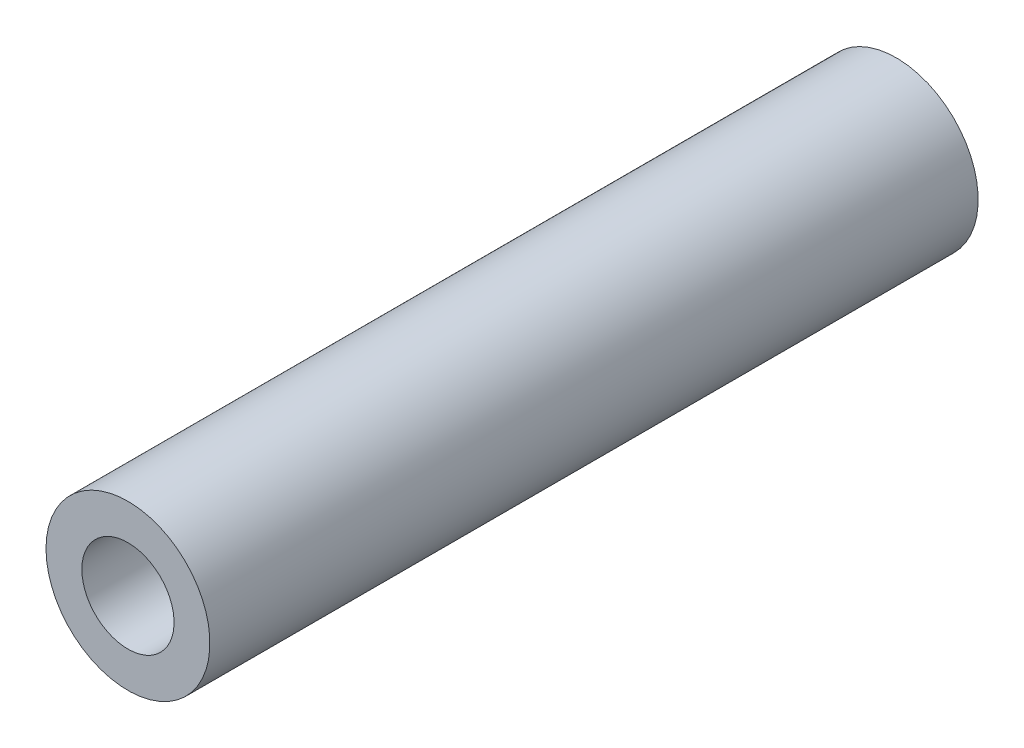
ISO-10303-21;
HEADER;
FILE_DESCRIPTION(('STEP AP214'),'2;1');
FILE_NAME('part.step','',(''),(''),'','','');
FILE_SCHEMA(('AUTOMOTIVE_DESIGN { 1 0 10303 214 1 1 1 1 }'));
ENDSEC;
DATA;
#1=APPLICATION_CONTEXT('core data for automotive mechanical design processes');
#2=APPLICATION_PROTOCOL_DEFINITION('international standard','automotive_design',2000,#1);
#3=PRODUCT_CONTEXT('',#1,'mechanical');
#4=PRODUCT('Part','Part','',(#3));
#5=PRODUCT_RELATED_PRODUCT_CATEGORY('part','',(#4));
#6=PRODUCT_DEFINITION_FORMATION('','',#4);
#7=PRODUCT_DEFINITION_CONTEXT('part definition',#1,'design');
#8=PRODUCT_DEFINITION('design','',#6,#7);
#9=PRODUCT_DEFINITION_SHAPE('','',#8);
#10=(LENGTH_UNIT() NAMED_UNIT(*) SI_UNIT(.MILLI.,.METRE.));
#11=(NAMED_UNIT(*) PLANE_ANGLE_UNIT() SI_UNIT($,.RADIAN.));
#12=(NAMED_UNIT(*) SI_UNIT($,.STERADIAN.) SOLID_ANGLE_UNIT());
#13=UNCERTAINTY_MEASURE_WITH_UNIT(LENGTH_MEASURE(1.E-05),#10,'distance_accuracy_value','');
#14=(GEOMETRIC_REPRESENTATION_CONTEXT(3) GLOBAL_UNCERTAINTY_ASSIGNED_CONTEXT((#13)) GLOBAL_UNIT_ASSIGNED_CONTEXT((#10,
#11,#12)) REPRESENTATION_CONTEXT('',''));
#15=CARTESIAN_POINT('',(0.,0.,0.));
#16=DIRECTION('',(0.,0.,1.));
#17=DIRECTION('',(1.,0.,0.));
#18=AXIS2_PLACEMENT_3D('',#15,#16,#17);
#19=CARTESIAN_POINT('',(0.,0.,45.));
#20=DIRECTION('',(0.,0.,-1.));
#21=DIRECTION('',(-1.,0.,0.));
#22=AXIS2_PLACEMENT_3D('',#19,#20,#21);
#23=CYLINDRICAL_SURFACE('',#22,2.7);
#24=CARTESIAN_POINT('',(0.,0.,45.));
#25=DIRECTION('',(0.,0.,1.));
#26=DIRECTION('',(1.,0.,0.));
#27=AXIS2_PLACEMENT_3D('',#24,#25,#26);
#28=CIRCLE('',#27,2.7);
#29=CARTESIAN_POINT('',(-2.7,0.,45.));
#30=VERTEX_POINT('',#29);
#31=EDGE_CURVE('E45',#30,#30,#28,.T.);
#32=CARTESIAN_POINT('',(0.,0.,0.));
#33=DIRECTION('',(0.,0.,1.));
#34=DIRECTION('',(1.,0.,0.));
#35=AXIS2_PLACEMENT_3D('',#32,#33,#34);
#36=CIRCLE('',#35,2.7);
#37=CARTESIAN_POINT('',(-2.7,0.,0.));
#38=VERTEX_POINT('',#37);
#39=EDGE_CURVE('E51',#38,#38,#36,.T.);
#40=CARTESIAN_POINT('',(-2.7,0.,45.));
#41=CARTESIAN_POINT('',(-2.7,0.,44.53125));
#42=CARTESIAN_POINT('',(-2.7,0.,44.0625));
#43=CARTESIAN_POINT('',(-2.7,0.,43.125));
#44=CARTESIAN_POINT('',(-2.7,0.,42.65625));
#45=CARTESIAN_POINT('',(-2.7,0.,41.71875));
#46=CARTESIAN_POINT('',(-2.7,0.,41.25));
#47=CARTESIAN_POINT('',(-2.7,0.,40.3125));
#48=CARTESIAN_POINT('',(-2.7,0.,39.84375));
#49=CARTESIAN_POINT('',(-2.7,0.,38.90625));
#50=CARTESIAN_POINT('',(-2.7,0.,38.4375));
#51=CARTESIAN_POINT('',(-2.7,0.,37.5));
#52=CARTESIAN_POINT('',(-2.7,0.,37.03125));
#53=CARTESIAN_POINT('',(-2.7,0.,36.09375));
#54=CARTESIAN_POINT('',(-2.7,0.,35.625));
#55=CARTESIAN_POINT('',(-2.7,0.,34.6875));
#56=CARTESIAN_POINT('',(-2.7,0.,34.21875));
#57=CARTESIAN_POINT('',(-2.7,0.,33.28125));
#58=CARTESIAN_POINT('',(-2.7,0.,32.8125));
#59=CARTESIAN_POINT('',(-2.7,0.,31.875));
#60=CARTESIAN_POINT('',(-2.7,0.,31.40625));
#61=CARTESIAN_POINT('',(-2.7,0.,30.46875));
#62=CARTESIAN_POINT('',(-2.7,0.,30.));
#63=CARTESIAN_POINT('',(-2.7,0.,29.0625));
#64=CARTESIAN_POINT('',(-2.7,0.,28.59375));
#65=CARTESIAN_POINT('',(-2.7,0.,27.65625));
#66=CARTESIAN_POINT('',(-2.7,0.,27.1875));
#67=CARTESIAN_POINT('',(-2.7,0.,26.25));
#68=CARTESIAN_POINT('',(-2.7,0.,25.78125));
#69=CARTESIAN_POINT('',(-2.7,0.,24.84375));
#70=CARTESIAN_POINT('',(-2.7,0.,24.375));
#71=CARTESIAN_POINT('',(-2.7,0.,23.4375));
#72=CARTESIAN_POINT('',(-2.7,0.,22.96875));
#73=CARTESIAN_POINT('',(-2.7,0.,22.03125));
#74=CARTESIAN_POINT('',(-2.7,0.,21.5625));
#75=CARTESIAN_POINT('',(-2.7,0.,20.625));
#76=CARTESIAN_POINT('',(-2.7,0.,20.15625));
#77=CARTESIAN_POINT('',(-2.7,0.,19.21875));
#78=CARTESIAN_POINT('',(-2.7,0.,18.75));
#79=CARTESIAN_POINT('',(-2.7,0.,17.8125));
#80=CARTESIAN_POINT('',(-2.7,0.,17.34375));
#81=CARTESIAN_POINT('',(-2.7,0.,16.40625));
#82=CARTESIAN_POINT('',(-2.7,0.,15.9375));
#83=CARTESIAN_POINT('',(-2.7,0.,15.));
#84=CARTESIAN_POINT('',(-2.7,0.,14.53125));
#85=CARTESIAN_POINT('',(-2.7,0.,13.59375));
#86=CARTESIAN_POINT('',(-2.7,0.,13.125));
#87=CARTESIAN_POINT('',(-2.7,0.,12.1875));
#88=CARTESIAN_POINT('',(-2.7,0.,11.71875));
#89=CARTESIAN_POINT('',(-2.7,0.,10.78125));
#90=CARTESIAN_POINT('',(-2.7,0.,10.3125));
#91=CARTESIAN_POINT('',(-2.7,0.,9.375));
#92=CARTESIAN_POINT('',(-2.7,0.,8.90625));
#93=CARTESIAN_POINT('',(-2.7,0.,7.96874999999999));
#94=CARTESIAN_POINT('',(-2.7,0.,7.5));
#95=CARTESIAN_POINT('',(-2.7,0.,6.5625));
#96=CARTESIAN_POINT('',(-2.7,0.,6.09375));
#97=CARTESIAN_POINT('',(-2.7,0.,5.15625));
#98=CARTESIAN_POINT('',(-2.7,0.,4.68749999999999));
#99=CARTESIAN_POINT('',(-2.7,0.,3.74999999999999));
#100=CARTESIAN_POINT('',(-2.7,0.,3.28124999999999));
#101=CARTESIAN_POINT('',(-2.7,0.,2.34374999999999));
#102=CARTESIAN_POINT('',(-2.7,0.,1.87499999999999));
#103=CARTESIAN_POINT('',(-2.7,0.,0.937499999999992));
#104=CARTESIAN_POINT('',(-2.7,0.,0.468749999999993));
#105=CARTESIAN_POINT('',(-2.7,0.,0.));
#106=B_SPLINE_CURVE_WITH_KNOTS('',3,(#40,#41,#42,#43,#44,#45,#46,#47,#48,#49,#50,#51,#52,#53,
#54,#55,#56,#57,#58,#59,#60,#61,#62,#63,#64,#65,#66,#67,#68,#69,#70,#71,#72,#73,#74,#75,#76,#77,
#78,#79,#80,#81,#82,#83,#84,#85,#86,#87,#88,#89,#90,#91,#92,#93,#94,#95,#96,#97,#98,#99,#100,
#101,#102,#103,#104,#105),.UNSPECIFIED.,.F.,.F.,(4,2,2,2,2,2,2,2,2,2,2,2,2,2,2,2,2,2,2,2,2,2,2,
2,2,2,2,2,2,2,2,2,4),(0.,1.40625,2.8125,4.21875000000001,5.62500000000001,7.03125,8.4375,
9.84375000000001,11.25,12.65625,14.0625,15.46875,16.875,18.28125,19.6875,21.09375,22.5,23.90625,
25.3125,26.71875,28.125,29.53125,30.9375,32.34375,33.75,35.15625,36.5625,37.96875,39.375,
40.78125,42.1875,43.59375,45.),.UNSPECIFIED.);
#107=EDGE_CURVE('BSEAM38',#30,#38,#106,.T.);
#108=ORIENTED_EDGE('',*,*,#31,.T.);
#109=ORIENTED_EDGE('',*,*,#39,.F.);
#110=ORIENTED_EDGE('',*,*,#107,.T.);
#111=ORIENTED_EDGE('',*,*,#107,.F.);
#112=EDGE_LOOP('',(#108,#110,#109,#111));
#113=FACE_BOUND('',#112,.T.);
#114=ADVANCED_FACE('F38',(#113),#23,.F.);
#115=CARTESIAN_POINT('',(0.,0.,45.));
#116=DIRECTION('',(0.,0.,-1.));
#117=DIRECTION('',(-1.,0.,0.));
#118=AXIS2_PLACEMENT_3D('',#115,#116,#117);
#119=CYLINDRICAL_SURFACE('',#118,4.8);
#120=CARTESIAN_POINT('',(0.,0.,45.));
#121=DIRECTION('',(0.,0.,1.));
#122=DIRECTION('',(1.,0.,0.));
#123=AXIS2_PLACEMENT_3D('',#120,#121,#122);
#124=CIRCLE('',#123,4.8);
#125=CARTESIAN_POINT('',(-4.8,0.,45.));
#126=VERTEX_POINT('',#125);
#127=EDGE_CURVE('E10',#126,#126,#124,.T.);
#128=CARTESIAN_POINT('',(0.,0.,0.));
#129=DIRECTION('',(0.,0.,1.));
#130=DIRECTION('',(1.,0.,0.));
#131=AXIS2_PLACEMENT_3D('',#128,#129,#130);
#132=CIRCLE('',#131,4.8);
#133=CARTESIAN_POINT('',(-4.8,0.,0.));
#134=VERTEX_POINT('',#133);
#135=EDGE_CURVE('E41',#134,#134,#132,.T.);
#136=CARTESIAN_POINT('',(-4.8,0.,45.));
#137=CARTESIAN_POINT('',(-4.8,0.,44.53125));
#138=CARTESIAN_POINT('',(-4.8,0.,44.0625));
#139=CARTESIAN_POINT('',(-4.8,0.,43.125));
#140=CARTESIAN_POINT('',(-4.8,0.,42.65625));
#141=CARTESIAN_POINT('',(-4.8,0.,41.71875));
#142=CARTESIAN_POINT('',(-4.8,0.,41.25));
#143=CARTESIAN_POINT('',(-4.8,0.,40.3125));
#144=CARTESIAN_POINT('',(-4.8,0.,39.84375));
#145=CARTESIAN_POINT('',(-4.8,0.,38.90625));
#146=CARTESIAN_POINT('',(-4.8,0.,38.4375));
#147=CARTESIAN_POINT('',(-4.8,0.,37.5));
#148=CARTESIAN_POINT('',(-4.8,0.,37.03125));
#149=CARTESIAN_POINT('',(-4.8,0.,36.09375));
#150=CARTESIAN_POINT('',(-4.8,0.,35.625));
#151=CARTESIAN_POINT('',(-4.8,0.,34.6875));
#152=CARTESIAN_POINT('',(-4.8,0.,34.21875));
#153=CARTESIAN_POINT('',(-4.8,0.,33.28125));
#154=CARTESIAN_POINT('',(-4.8,0.,32.8125));
#155=CARTESIAN_POINT('',(-4.8,0.,31.875));
#156=CARTESIAN_POINT('',(-4.8,0.,31.40625));
#157=CARTESIAN_POINT('',(-4.8,0.,30.46875));
#158=CARTESIAN_POINT('',(-4.8,0.,30.));
#159=CARTESIAN_POINT('',(-4.8,0.,29.0625));
#160=CARTESIAN_POINT('',(-4.8,0.,28.59375));
#161=CARTESIAN_POINT('',(-4.8,0.,27.65625));
#162=CARTESIAN_POINT('',(-4.8,0.,27.1875));
#163=CARTESIAN_POINT('',(-4.8,0.,26.25));
#164=CARTESIAN_POINT('',(-4.8,0.,25.78125));
#165=CARTESIAN_POINT('',(-4.8,0.,24.84375));
#166=CARTESIAN_POINT('',(-4.8,0.,24.375));
#167=CARTESIAN_POINT('',(-4.8,0.,23.4375));
#168=CARTESIAN_POINT('',(-4.8,0.,22.96875));
#169=CARTESIAN_POINT('',(-4.8,0.,22.03125));
#170=CARTESIAN_POINT('',(-4.8,0.,21.5625));
#171=CARTESIAN_POINT('',(-4.8,0.,20.625));
#172=CARTESIAN_POINT('',(-4.8,0.,20.15625));
#173=CARTESIAN_POINT('',(-4.8,0.,19.21875));
#174=CARTESIAN_POINT('',(-4.8,0.,18.75));
#175=CARTESIAN_POINT('',(-4.8,0.,17.8125));
#176=CARTESIAN_POINT('',(-4.8,0.,17.34375));
#177=CARTESIAN_POINT('',(-4.8,0.,16.40625));
#178=CARTESIAN_POINT('',(-4.8,0.,15.9375));
#179=CARTESIAN_POINT('',(-4.8,0.,15.));
#180=CARTESIAN_POINT('',(-4.8,0.,14.53125));
#181=CARTESIAN_POINT('',(-4.8,0.,13.59375));
#182=CARTESIAN_POINT('',(-4.8,0.,13.125));
#183=CARTESIAN_POINT('',(-4.8,0.,12.1875));
#184=CARTESIAN_POINT('',(-4.8,0.,11.71875));
#185=CARTESIAN_POINT('',(-4.8,0.,10.78125));
#186=CARTESIAN_POINT('',(-4.8,0.,10.3125));
#187=CARTESIAN_POINT('',(-4.8,0.,9.375));
#188=CARTESIAN_POINT('',(-4.8,0.,8.90625));
#189=CARTESIAN_POINT('',(-4.8,0.,7.96874999999999));
#190=CARTESIAN_POINT('',(-4.8,0.,7.5));
#191=CARTESIAN_POINT('',(-4.8,0.,6.5625));
#192=CARTESIAN_POINT('',(-4.8,0.,6.09375));
#193=CARTESIAN_POINT('',(-4.8,0.,5.15625));
#194=CARTESIAN_POINT('',(-4.8,0.,4.68749999999999));
#195=CARTESIAN_POINT('',(-4.8,0.,3.74999999999999));
#196=CARTESIAN_POINT('',(-4.8,0.,3.28124999999999));
#197=CARTESIAN_POINT('',(-4.8,0.,2.34374999999999));
#198=CARTESIAN_POINT('',(-4.8,0.,1.87499999999999));
#199=CARTESIAN_POINT('',(-4.8,0.,0.937499999999992));
#200=CARTESIAN_POINT('',(-4.8,0.,0.468749999999993));
#201=CARTESIAN_POINT('',(-4.8,0.,0.));
#202=B_SPLINE_CURVE_WITH_KNOTS('',3,(#136,#137,#138,#139,#140,#141,#142,#143,#144,#145,#146,
#147,#148,#149,#150,#151,#152,#153,#154,#155,#156,#157,#158,#159,#160,#161,#162,#163,#164,#165,
#166,#167,#168,#169,#170,#171,#172,#173,#174,#175,#176,#177,#178,#179,#180,#181,#182,#183,#184,
#185,#186,#187,#188,#189,#190,#191,#192,#193,#194,#195,#196,#197,#198,#199,#200,#201),
.UNSPECIFIED.,.F.,.F.,(4,2,2,2,2,2,2,2,2,2,2,2,2,2,2,2,2,2,2,2,2,2,2,2,2,2,2,2,2,2,2,2,4),(0.,
1.40625,2.8125,4.21875000000001,5.62500000000001,7.03125,8.4375,9.84375000000001,11.25,12.65625,
14.0625,15.46875,16.875,18.28125,19.6875,21.09375,22.5,23.90625,25.3125,26.71875,28.125,
29.53125,30.9375,32.34375,33.75,35.15625,36.5625,37.96875,39.375,40.78125,42.1875,43.59375,45.),.UNSPECIFIED.);
#203=EDGE_CURVE('BSEAM58',#126,#134,#202,.T.);
#204=ORIENTED_EDGE('',*,*,#127,.F.);
#205=ORIENTED_EDGE('',*,*,#135,.T.);
#206=ORIENTED_EDGE('',*,*,#203,.T.);
#207=ORIENTED_EDGE('',*,*,#203,.F.);
#208=EDGE_LOOP('',(#204,#206,#205,#207));
#209=FACE_BOUND('',#208,.T.);
#210=ADVANCED_FACE('F58',(#209),#119,.T.);
#211=CARTESIAN_POINT('',(0.,0.,45.));
#212=DIRECTION('',(0.,0.,1.));
#213=DIRECTION('',(1.,0.,0.));
#214=AXIS2_PLACEMENT_3D('',#211,#212,#213);
#215=PLANE('',#214);
#216=ORIENTED_EDGE('',*,*,#31,.F.);
#217=EDGE_LOOP('',(#216));
#218=FACE_BOUND('',#217,.T.);
#219=ORIENTED_EDGE('',*,*,#127,.T.);
#220=EDGE_LOOP('',(#219));
#221=FACE_BOUND('',#220,.T.);
#222=ADVANCED_FACE('F62',(#218,#221),#215,.T.);
#223=CARTESIAN_POINT('',(0.,0.,0.));
#224=DIRECTION('',(0.,0.,1.));
#225=DIRECTION('',(1.,0.,0.));
#226=AXIS2_PLACEMENT_3D('',#223,#224,#225);
#227=PLANE('',#226);
#228=ORIENTED_EDGE('',*,*,#39,.T.);
#229=EDGE_LOOP('',(#228));
#230=FACE_BOUND('',#229,.T.);
#231=ORIENTED_EDGE('',*,*,#135,.F.);
#232=EDGE_LOOP('',(#231));
#233=FACE_BOUND('',#232,.T.);
#234=ADVANCED_FACE('F60',(#230,#233),#227,.F.);
#235=CLOSED_SHELL('',(#114,#210,#222,#234));
#236=MANIFOLD_SOLID_BREP('B2',#235);
#237=ADVANCED_BREP_SHAPE_REPRESENTATION('',(#18,#236),#14);
#238=SHAPE_DEFINITION_REPRESENTATION(#9,#237);
ENDSEC;
END-ISO-10303-21;
